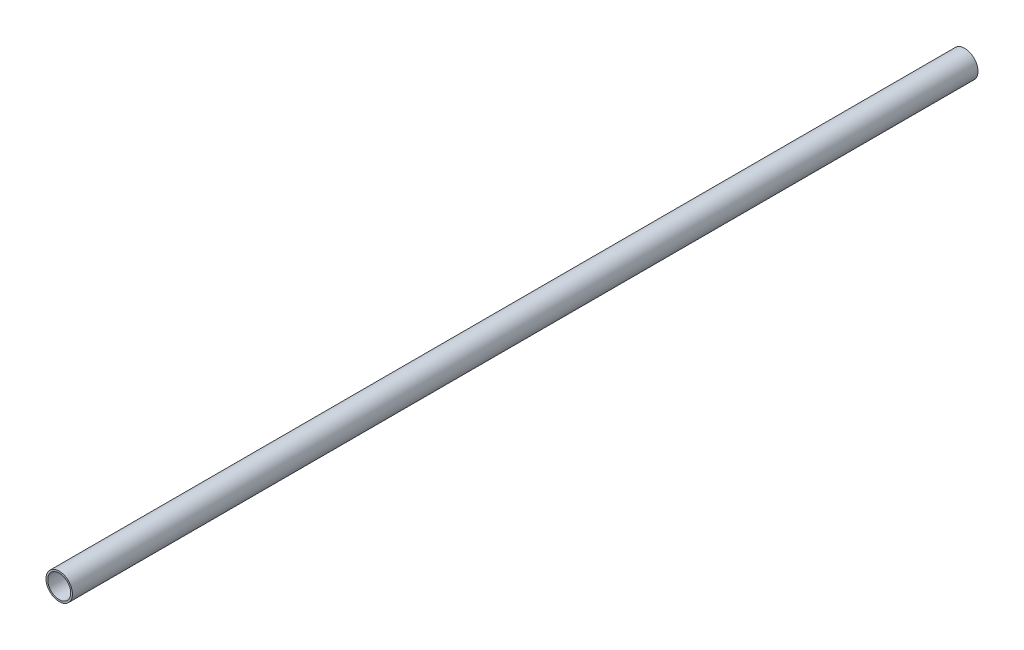
ISO-10303-21;
HEADER;
FILE_DESCRIPTION(('STEP AP214'),'2;1');
FILE_NAME('part.step','',(''),(''),'','','');
FILE_SCHEMA(('AUTOMOTIVE_DESIGN { 1 0 10303 214 1 1 1 1 }'));
ENDSEC;
DATA;
#1=APPLICATION_CONTEXT('core data for automotive mechanical design processes');
#2=APPLICATION_PROTOCOL_DEFINITION('international standard','automotive_design',2000,#1);
#3=PRODUCT_CONTEXT('',#1,'mechanical');
#4=PRODUCT('Part','Part','',(#3));
#5=PRODUCT_RELATED_PRODUCT_CATEGORY('part','',(#4));
#6=PRODUCT_DEFINITION_FORMATION('','',#4);
#7=PRODUCT_DEFINITION_CONTEXT('part definition',#1,'design');
#8=PRODUCT_DEFINITION('design','',#6,#7);
#9=PRODUCT_DEFINITION_SHAPE('','',#8);
#10=(LENGTH_UNIT() NAMED_UNIT(*) SI_UNIT(.MILLI.,.METRE.));
#11=(NAMED_UNIT(*) PLANE_ANGLE_UNIT() SI_UNIT($,.RADIAN.));
#12=(NAMED_UNIT(*) SI_UNIT($,.STERADIAN.) SOLID_ANGLE_UNIT());
#13=UNCERTAINTY_MEASURE_WITH_UNIT(LENGTH_MEASURE(1.E-05),#10,'distance_accuracy_value','');
#14=(GEOMETRIC_REPRESENTATION_CONTEXT(3) GLOBAL_UNCERTAINTY_ASSIGNED_CONTEXT((#13)) GLOBAL_UNIT_ASSIGNED_CONTEXT((#10,
#11,#12)) REPRESENTATION_CONTEXT('',''));
#15=CARTESIAN_POINT('',(0.,0.,0.));
#16=DIRECTION('',(0.,0.,1.));
#17=DIRECTION('',(1.,0.,0.));
#18=AXIS2_PLACEMENT_3D('',#15,#16,#17);
#19=CARTESIAN_POINT('',(0.,0.,760.));
#20=DIRECTION('',(0.,0.,1.));
#21=DIRECTION('',(1.,0.,0.));
#22=AXIS2_PLACEMENT_3D('',#19,#20,#21);
#23=PLANE('',#22);
#24=CARTESIAN_POINT('',(0.,0.,760.));
#25=DIRECTION('',(0.,0.,1.));
#26=DIRECTION('',(1.,0.,0.));
#27=AXIS2_PLACEMENT_3D('',#24,#25,#26);
#28=CIRCLE('',#27,11.1125);
#29=CARTESIAN_POINT('',(11.1125,0.,760.));
#30=VERTEX_POINT('',#29);
#31=EDGE_CURVE('E10',#30,#30,#28,.T.);
#32=ORIENTED_EDGE('',*,*,#31,.T.);
#33=EDGE_LOOP('',(#32));
#34=FACE_BOUND('',#33,.T.);
#35=CARTESIAN_POINT('',(0.,0.,760.));
#36=DIRECTION('',(0.,0.,1.));
#37=DIRECTION('',(1.,0.,0.));
#38=AXIS2_PLACEMENT_3D('',#35,#36,#37);
#39=CIRCLE('',#38,9.6395);
#40=CARTESIAN_POINT('',(9.6395,0.,760.));
#41=VERTEX_POINT('',#40);
#42=EDGE_CURVE('E48',#41,#41,#39,.T.);
#43=ORIENTED_EDGE('',*,*,#42,.F.);
#44=EDGE_LOOP('',(#43));
#45=FACE_BOUND('',#44,.T.);
#46=ADVANCED_FACE('F37',(#34,#45),#23,.T.);
#47=CARTESIAN_POINT('',(0.,0.,0.));
#48=DIRECTION('',(0.,0.,1.));
#49=DIRECTION('',(1.,0.,0.));
#50=AXIS2_PLACEMENT_3D('',#47,#48,#49);
#51=PLANE('',#50);
#52=CARTESIAN_POINT('',(0.,0.,0.));
#53=DIRECTION('',(0.,0.,1.));
#54=DIRECTION('',(1.,0.,0.));
#55=AXIS2_PLACEMENT_3D('',#52,#53,#54);
#56=CIRCLE('',#55,11.1125);
#57=CARTESIAN_POINT('',(11.1125,0.,0.));
#58=VERTEX_POINT('',#57);
#59=EDGE_CURVE('E41',#58,#58,#56,.T.);
#60=ORIENTED_EDGE('',*,*,#59,.F.);
#61=EDGE_LOOP('',(#60));
#62=FACE_BOUND('',#61,.T.);
#63=CARTESIAN_POINT('',(0.,0.,0.));
#64=DIRECTION('',(0.,0.,1.));
#65=DIRECTION('',(1.,0.,0.));
#66=AXIS2_PLACEMENT_3D('',#63,#64,#65);
#67=CIRCLE('',#66,9.6395);
#68=CARTESIAN_POINT('',(9.6395,0.,0.));
#69=VERTEX_POINT('',#68);
#70=EDGE_CURVE('E50',#69,#69,#67,.T.);
#71=ORIENTED_EDGE('',*,*,#70,.T.);
#72=EDGE_LOOP('',(#71));
#73=FACE_BOUND('',#72,.T.);
#74=ADVANCED_FACE('F60',(#62,#73),#51,.F.);
#75=CARTESIAN_POINT('',(0.,0.,760.));
#76=DIRECTION('',(0.,0.,-1.));
#77=DIRECTION('',(-1.,0.,0.));
#78=AXIS2_PLACEMENT_3D('',#75,#76,#77);
#79=CYLINDRICAL_SURFACE('',#78,11.1125);
#80=ORIENTED_EDGE('',*,*,#31,.F.);
#81=EDGE_LOOP('',(#80));
#82=FACE_BOUND('',#81,.T.);
#83=ORIENTED_EDGE('',*,*,#59,.T.);
#84=EDGE_LOOP('',(#83));
#85=FACE_BOUND('',#84,.T.);
#86=ADVANCED_FACE('F39',(#82,#85),#79,.T.);
#87=CARTESIAN_POINT('',(0.,0.,760.));
#88=DIRECTION('',(0.,0.,-1.));
#89=DIRECTION('',(-1.,0.,0.));
#90=AXIS2_PLACEMENT_3D('',#87,#88,#89);
#91=CYLINDRICAL_SURFACE('',#90,9.6395);
#92=ORIENTED_EDGE('',*,*,#42,.T.);
#93=EDGE_LOOP('',(#92));
#94=FACE_BOUND('',#93,.T.);
#95=ORIENTED_EDGE('',*,*,#70,.F.);
#96=EDGE_LOOP('',(#95));
#97=FACE_BOUND('',#96,.T.);
#98=ADVANCED_FACE('F56',(#94,#97),#91,.F.);
#99=CLOSED_SHELL('',(#46,#74,#86,#98));
#100=MANIFOLD_SOLID_BREP('B2',#99);
#101=ADVANCED_BREP_SHAPE_REPRESENTATION('',(#18,#100),#14);
#102=SHAPE_DEFINITION_REPRESENTATION(#9,#101);
ENDSEC;
END-ISO-10303-21;
